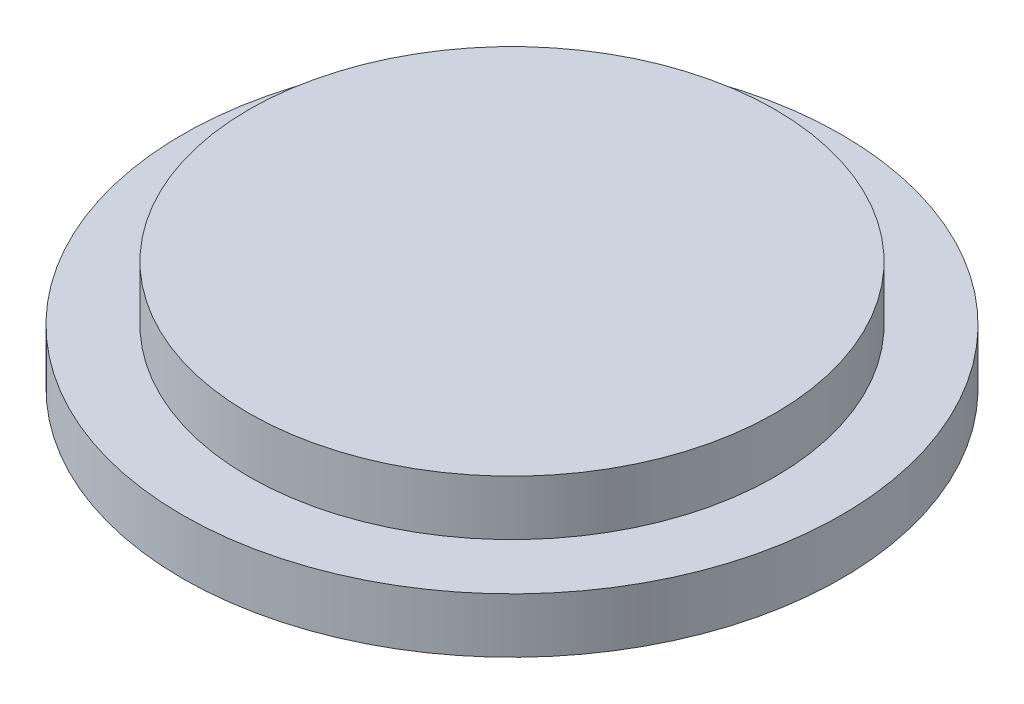
ISO-10303-21;
HEADER;
FILE_DESCRIPTION(('STEP AP214'),'2;1');
FILE_NAME('part.step','',(''),(''),'','','');
FILE_SCHEMA(('AUTOMOTIVE_DESIGN { 1 0 10303 214 1 1 1 1 }'));
ENDSEC;
DATA;
#1=APPLICATION_CONTEXT('core data for automotive mechanical design processes');
#2=APPLICATION_PROTOCOL_DEFINITION('international standard','automotive_design',2000,#1);
#3=PRODUCT_CONTEXT('',#1,'mechanical');
#4=PRODUCT('Part','Part','',(#3));
#5=PRODUCT_RELATED_PRODUCT_CATEGORY('part','',(#4));
#6=PRODUCT_DEFINITION_FORMATION('','',#4);
#7=PRODUCT_DEFINITION_CONTEXT('part definition',#1,'design');
#8=PRODUCT_DEFINITION('design','',#6,#7);
#9=PRODUCT_DEFINITION_SHAPE('','',#8);
#10=(LENGTH_UNIT() NAMED_UNIT(*) SI_UNIT(.MILLI.,.METRE.));
#11=(NAMED_UNIT(*) PLANE_ANGLE_UNIT() SI_UNIT($,.RADIAN.));
#12=(NAMED_UNIT(*) SI_UNIT($,.STERADIAN.) SOLID_ANGLE_UNIT());
#13=UNCERTAINTY_MEASURE_WITH_UNIT(LENGTH_MEASURE(1.E-05),#10,'distance_accuracy_value','');
#14=(GEOMETRIC_REPRESENTATION_CONTEXT(3) GLOBAL_UNCERTAINTY_ASSIGNED_CONTEXT((#13)) GLOBAL_UNIT_ASSIGNED_CONTEXT((#10,
#11,#12)) REPRESENTATION_CONTEXT('',''));
#15=CARTESIAN_POINT('',(0.,0.,0.));
#16=DIRECTION('',(0.,0.,1.));
#17=DIRECTION('',(1.,0.,0.));
#18=AXIS2_PLACEMENT_3D('',#15,#16,#17);
#19=CARTESIAN_POINT('',(0.,10.,0.));
#20=DIRECTION('',(0.,-1.,0.));
#21=DIRECTION('',(0.,0.,-1.));
#22=AXIS2_PLACEMENT_3D('',#19,#20,#21);
#23=CYLINDRICAL_SURFACE('',#22,47.9);
#24=CARTESIAN_POINT('',(0.,10.,0.));
#25=DIRECTION('',(0.,1.,0.));
#26=DIRECTION('',(0.,0.,1.));
#27=AXIS2_PLACEMENT_3D('',#24,#25,#26);
#28=CIRCLE('',#27,47.9);
#29=CARTESIAN_POINT('',(0.,10.,47.9));
#30=VERTEX_POINT('',#29);
#31=EDGE_CURVE('E10',#30,#30,#28,.T.);
#32=ORIENTED_EDGE('',*,*,#31,.F.);
#33=EDGE_LOOP('',(#32));
#34=FACE_BOUND('',#33,.T.);
#35=CARTESIAN_POINT('',(0.,0.,0.));
#36=DIRECTION('',(0.,-1.,0.));
#37=DIRECTION('',(0.,0.,-1.));
#38=AXIS2_PLACEMENT_3D('',#35,#36,#37);
#39=CIRCLE('',#38,47.9);
#40=CARTESIAN_POINT('',(0.,0.,-47.9));
#41=VERTEX_POINT('',#40);
#42=EDGE_CURVE('E37',#41,#41,#39,.T.);
#43=ORIENTED_EDGE('',*,*,#42,.F.);
#44=EDGE_LOOP('',(#43));
#45=FACE_BOUND('',#44,.T.);
#46=ADVANCED_FACE('F31',(#34,#45),#23,.T.);
#47=CARTESIAN_POINT('',(0.,10.,0.));
#48=DIRECTION('',(0.,1.,0.));
#49=DIRECTION('',(0.,0.,1.));
#50=AXIS2_PLACEMENT_3D('',#47,#48,#49);
#51=PLANE('',#50);
#52=ORIENTED_EDGE('',*,*,#31,.T.);
#53=EDGE_LOOP('',(#52));
#54=FACE_BOUND('',#53,.T.);
#55=ADVANCED_FACE('F64',(#54),#51,.T.);
#56=CARTESIAN_POINT('',(0.,-10.,0.));
#57=DIRECTION('',(0.,1.,0.));
#58=DIRECTION('',(0.,0.,1.));
#59=AXIS2_PLACEMENT_3D('',#56,#57,#58);
#60=CYLINDRICAL_SURFACE('',#59,60.);
#61=CARTESIAN_POINT('',(0.,-10.,0.));
#62=DIRECTION('',(0.,-1.,0.));
#63=DIRECTION('',(0.,0.,-1.));
#64=AXIS2_PLACEMENT_3D('',#61,#62,#63);
#65=CIRCLE('',#64,60.);
#66=CARTESIAN_POINT('',(0.,-10.,-60.));
#67=VERTEX_POINT('',#66);
#68=EDGE_CURVE('E41',#67,#67,#65,.T.);
#69=ORIENTED_EDGE('',*,*,#68,.F.);
#70=EDGE_LOOP('',(#69));
#71=FACE_BOUND('',#70,.T.);
#72=CARTESIAN_POINT('',(0.,0.,0.));
#73=DIRECTION('',(0.,-1.,0.));
#74=DIRECTION('',(0.,0.,-1.));
#75=AXIS2_PLACEMENT_3D('',#72,#73,#74);
#76=CIRCLE('',#75,60.);
#77=CARTESIAN_POINT('',(0.,0.,-60.));
#78=VERTEX_POINT('',#77);
#79=EDGE_CURVE('E45',#78,#78,#76,.T.);
#80=ORIENTED_EDGE('',*,*,#79,.T.);
#81=EDGE_LOOP('',(#80));
#82=FACE_BOUND('',#81,.T.);
#83=ADVANCED_FACE('F51',(#71,#82),#60,.T.);
#84=CARTESIAN_POINT('',(0.,-10.,0.));
#85=DIRECTION('',(0.,-1.,0.));
#86=DIRECTION('',(0.,0.,-1.));
#87=AXIS2_PLACEMENT_3D('',#84,#85,#86);
#88=PLANE('',#87);
#89=ORIENTED_EDGE('',*,*,#68,.T.);
#90=EDGE_LOOP('',(#89));
#91=FACE_BOUND('',#90,.T.);
#92=ADVANCED_FACE('F55',(#91),#88,.T.);
#93=CARTESIAN_POINT('',(0.,0.,0.));
#94=DIRECTION('',(0.,-1.,0.));
#95=DIRECTION('',(0.,0.,-1.));
#96=AXIS2_PLACEMENT_3D('',#93,#94,#95);
#97=PLANE('',#96);
#98=ORIENTED_EDGE('',*,*,#42,.T.);
#99=EDGE_LOOP('',(#98));
#100=FACE_BOUND('',#99,.T.);
#101=ORIENTED_EDGE('',*,*,#79,.F.);
#102=EDGE_LOOP('',(#101));
#103=FACE_BOUND('',#102,.T.);
#104=ADVANCED_FACE('F53',(#100,#103),#97,.F.);
#105=CLOSED_SHELL('',(#46,#55,#83,#92,#104));
#106=MANIFOLD_SOLID_BREP('B2',#105);
#107=ADVANCED_BREP_SHAPE_REPRESENTATION('',(#18,#106),#14);
#108=SHAPE_DEFINITION_REPRESENTATION(#9,#107);
ENDSEC;
END-ISO-10303-21;
